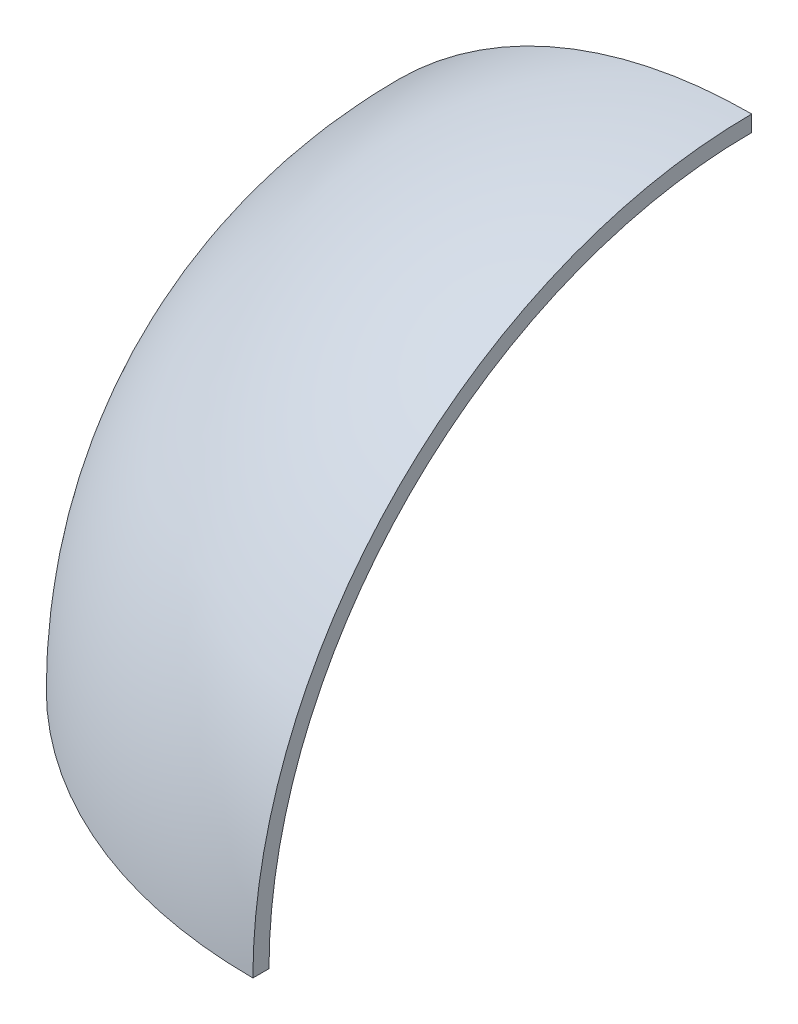
ISO-10303-21;
HEADER;
FILE_DESCRIPTION(('STEP AP214'),'2;1');
FILE_NAME('part.step','',(''),(''),'','','');
FILE_SCHEMA(('AUTOMOTIVE_DESIGN { 1 0 10303 214 1 1 1 1 }'));
ENDSEC;
DATA;
#1=APPLICATION_CONTEXT('core data for automotive mechanical design processes');
#2=APPLICATION_PROTOCOL_DEFINITION('international standard','automotive_design',2000,#1);
#3=PRODUCT_CONTEXT('',#1,'mechanical');
#4=PRODUCT('Part','Part','',(#3));
#5=PRODUCT_RELATED_PRODUCT_CATEGORY('part','',(#4));
#6=PRODUCT_DEFINITION_FORMATION('','',#4);
#7=PRODUCT_DEFINITION_CONTEXT('part definition',#1,'design');
#8=PRODUCT_DEFINITION('design','',#6,#7);
#9=PRODUCT_DEFINITION_SHAPE('','',#8);
#10=(LENGTH_UNIT() NAMED_UNIT(*) SI_UNIT(.MILLI.,.METRE.));
#11=(NAMED_UNIT(*) PLANE_ANGLE_UNIT() SI_UNIT($,.RADIAN.));
#12=(NAMED_UNIT(*) SI_UNIT($,.STERADIAN.) SOLID_ANGLE_UNIT());
#13=UNCERTAINTY_MEASURE_WITH_UNIT(LENGTH_MEASURE(1.E-05),#10,'distance_accuracy_value','');
#14=(GEOMETRIC_REPRESENTATION_CONTEXT(3) GLOBAL_UNCERTAINTY_ASSIGNED_CONTEXT((#13)) GLOBAL_UNIT_ASSIGNED_CONTEXT((#10,
#11,#12)) REPRESENTATION_CONTEXT('',''));
#15=CARTESIAN_POINT('',(0.,0.,0.));
#16=DIRECTION('',(0.,0.,1.));
#17=DIRECTION('',(1.,0.,0.));
#18=AXIS2_PLACEMENT_3D('',#15,#16,#17);
#19=CARTESIAN_POINT('',(0.,0.,0.));
#20=DIRECTION('',(0.,-1.,0.));
#21=DIRECTION('',(0.,0.,1.));
#22=AXIS2_PLACEMENT_3D('',#19,#20,#21);
#23=SPHERICAL_SURFACE('',#22,30.);
#24=CARTESIAN_POINT('',(0.,0.,0.));
#25=DIRECTION('',(0.,0.,-1.));
#26=DIRECTION('',(1.,0.,0.));
#27=AXIS2_PLACEMENT_3D('',#24,#25,#26);
#28=CIRCLE('',#27,30.);
#29=CARTESIAN_POINT('',(-30.,0.,0.));
#30=VERTEX_POINT('',#29);
#31=CARTESIAN_POINT('',(0.,30.,0.));
#32=VERTEX_POINT('',#31);
#33=EDGE_CURVE('E71',#30,#32,#28,.T.);
#34=ORIENTED_EDGE('',*,*,#33,.T.);
#35=CARTESIAN_POINT('',(0.,0.,0.));
#36=DIRECTION('',(-1.,0.,0.));
#37=DIRECTION('',(0.,0.,-1.));
#38=AXIS2_PLACEMENT_3D('',#35,#36,#37);
#39=CIRCLE('',#38,30.);
#40=CARTESIAN_POINT('',(1.04744440165294E-13,0.,30.));
#41=VERTEX_POINT('',#40);
#42=EDGE_CURVE('E76',#41,#32,#39,.T.);
#43=ORIENTED_EDGE('',*,*,#42,.F.);
#44=CARTESIAN_POINT('',(0.,0.,0.));
#45=DIRECTION('',(0.,-1.,0.));
#46=DIRECTION('',(0.,0.,-1.));
#47=AXIS2_PLACEMENT_3D('',#44,#45,#46);
#48=CIRCLE('',#47,30.);
#49=EDGE_CURVE('E39',#41,#30,#48,.T.);
#50=ORIENTED_EDGE('',*,*,#49,.T.);
#51=EDGE_LOOP('',(#34,#43,#50));
#52=FACE_BOUND('',#51,.T.);
#53=ADVANCED_FACE('F31',(#52),#23,.F.);
#54=CARTESIAN_POINT('',(0.,0.,0.));
#55=DIRECTION('',(0.,-1.,0.));
#56=DIRECTION('',(0.,0.,1.));
#57=AXIS2_PLACEMENT_3D('',#54,#55,#56);
#58=SPHERICAL_SURFACE('',#57,31.);
#59=CARTESIAN_POINT('',(0.,0.,0.));
#60=DIRECTION('',(0.,-1.,0.));
#61=DIRECTION('',(0.,0.,-1.));
#62=AXIS2_PLACEMENT_3D('',#59,#60,#61);
#63=CIRCLE('',#62,31.);
#64=CARTESIAN_POINT('',(1.08235921504137E-13,0.,31.));
#65=VERTEX_POINT('',#64);
#66=CARTESIAN_POINT('',(-31.,0.,0.));
#67=VERTEX_POINT('',#66);
#68=EDGE_CURVE('E11',#65,#67,#63,.T.);
#69=ORIENTED_EDGE('',*,*,#68,.F.);
#70=CARTESIAN_POINT('',(0.,0.,0.));
#71=DIRECTION('',(1.,0.,0.));
#72=DIRECTION('',(0.,0.,-1.));
#73=AXIS2_PLACEMENT_3D('',#70,#71,#72);
#74=CIRCLE('',#73,31.);
#75=CARTESIAN_POINT('',(0.,31.,0.));
#76=VERTEX_POINT('',#75);
#77=EDGE_CURVE('E68',#76,#65,#74,.T.);
#78=ORIENTED_EDGE('',*,*,#77,.F.);
#79=CARTESIAN_POINT('',(0.,0.,0.));
#80=DIRECTION('',(0.,0.,1.));
#81=DIRECTION('',(1.,0.,0.));
#82=AXIS2_PLACEMENT_3D('',#79,#80,#81);
#83=CIRCLE('',#82,31.);
#84=EDGE_CURVE('E67',#76,#67,#83,.T.);
#85=ORIENTED_EDGE('',*,*,#84,.T.);
#86=EDGE_LOOP('',(#69,#78,#85));
#87=FACE_BOUND('',#86,.T.);
#88=ADVANCED_FACE('F33',(#87),#58,.T.);
#89=CARTESIAN_POINT('',(1.04744440165294E-13,0.,30.));
#90=DIRECTION('',(0.,1.,0.));
#91=DIRECTION('',(0.,0.,1.));
#92=AXIS2_PLACEMENT_3D('',#89,#90,#91);
#93=PLANE('',#92);
#94=DIRECTION('',(0.,0.,-1.));
#95=VECTOR('',#94,1.);
#96=CARTESIAN_POINT('',(1.04744440165294E-13,0.,30.));
#97=LINE('',#96,#95);
#98=EDGE_CURVE('E66',#65,#41,#97,.T.);
#99=ORIENTED_EDGE('',*,*,#98,.F.);
#100=ORIENTED_EDGE('',*,*,#68,.T.);
#101=DIRECTION('',(1.,0.,0.));
#102=VECTOR('',#101,1.);
#103=CARTESIAN_POINT('',(-30.,0.,0.));
#104=LINE('',#103,#102);
#105=EDGE_CURVE('E64',#67,#30,#104,.T.);
#106=ORIENTED_EDGE('',*,*,#105,.T.);
#107=ORIENTED_EDGE('',*,*,#49,.F.);
#108=EDGE_LOOP('',(#99,#100,#106,#107));
#109=FACE_BOUND('',#108,.T.);
#110=ADVANCED_FACE('F62',(#109),#93,.F.);
#111=CARTESIAN_POINT('',(0.,0.,0.));
#112=DIRECTION('',(1.,0.,0.));
#113=DIRECTION('',(0.,0.,-1.));
#114=AXIS2_PLACEMENT_3D('',#111,#112,#113);
#115=PLANE('',#114);
#116=ORIENTED_EDGE('',*,*,#42,.T.);
#117=DIRECTION('',(0.,1.,0.));
#118=VECTOR('',#117,1.);
#119=CARTESIAN_POINT('',(0.,30.,0.));
#120=LINE('',#119,#118);
#121=EDGE_CURVE('E79',#32,#76,#120,.T.);
#122=ORIENTED_EDGE('',*,*,#121,.T.);
#123=ORIENTED_EDGE('',*,*,#77,.T.);
#124=ORIENTED_EDGE('',*,*,#98,.T.);
#125=EDGE_LOOP('',(#116,#122,#123,#124));
#126=FACE_BOUND('',#125,.T.);
#127=ADVANCED_FACE('F87',(#126),#115,.T.);
#128=CARTESIAN_POINT('',(0.,0.,0.));
#129=DIRECTION('',(0.,0.,1.));
#130=DIRECTION('',(1.,0.,0.));
#131=AXIS2_PLACEMENT_3D('',#128,#129,#130);
#132=PLANE('',#131);
#133=ORIENTED_EDGE('',*,*,#33,.F.);
#134=ORIENTED_EDGE('',*,*,#105,.F.);
#135=ORIENTED_EDGE('',*,*,#84,.F.);
#136=ORIENTED_EDGE('',*,*,#121,.F.);
#137=EDGE_LOOP('',(#133,#134,#135,#136));
#138=FACE_BOUND('',#137,.T.);
#139=ADVANCED_FACE('F74',(#138),#132,.F.);
#140=CLOSED_SHELL('',(#53,#88,#110,#127,#139));
#141=MANIFOLD_SOLID_BREP('B2',#140);
#142=ADVANCED_BREP_SHAPE_REPRESENTATION('',(#18,#141),#14);
#143=SHAPE_DEFINITION_REPRESENTATION(#9,#142);
ENDSEC;
END-ISO-10303-21;
